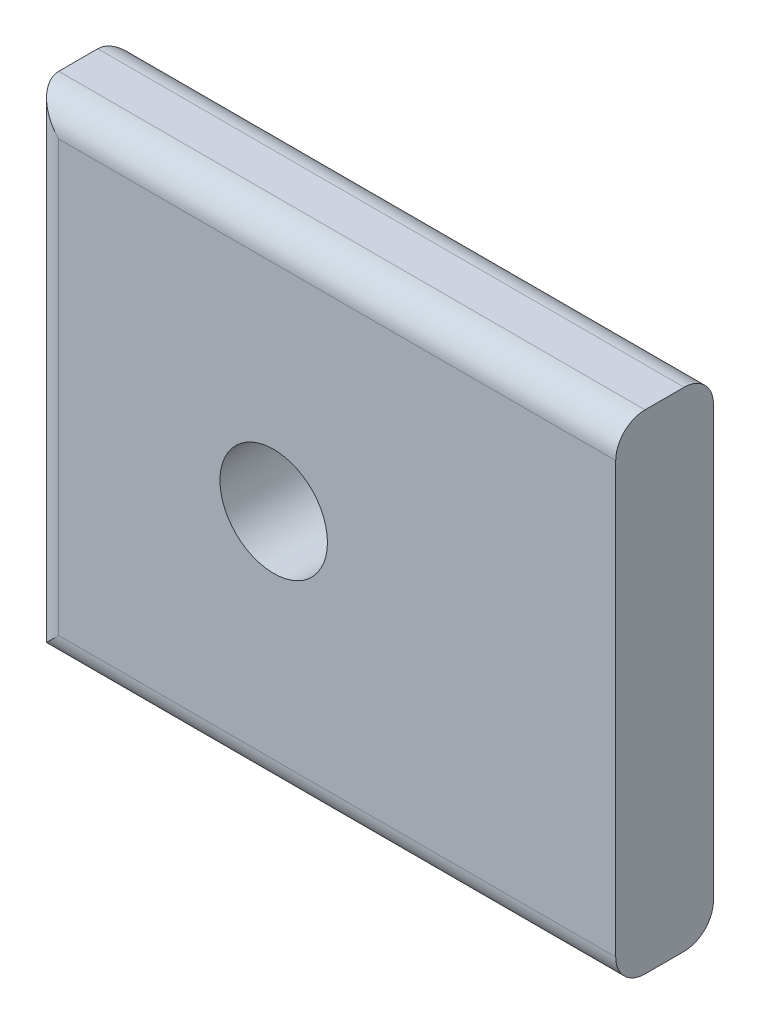
ISO-10303-21;
HEADER;
FILE_DESCRIPTION(('STEP AP214'),'2;1');
FILE_NAME('part.step','',(''),(''),'','','');
FILE_SCHEMA(('AUTOMOTIVE_DESIGN { 1 0 10303 214 1 1 1 1 }'));
ENDSEC;
DATA;
#1=APPLICATION_CONTEXT('core data for automotive mechanical design processes');
#2=APPLICATION_PROTOCOL_DEFINITION('international standard','automotive_design',2000,#1);
#3=PRODUCT_CONTEXT('',#1,'mechanical');
#4=PRODUCT('Part','Part','',(#3));
#5=PRODUCT_RELATED_PRODUCT_CATEGORY('part','',(#4));
#6=PRODUCT_DEFINITION_FORMATION('','',#4);
#7=PRODUCT_DEFINITION_CONTEXT('part definition',#1,'design');
#8=PRODUCT_DEFINITION('design','',#6,#7);
#9=PRODUCT_DEFINITION_SHAPE('','',#8);
#10=(LENGTH_UNIT() NAMED_UNIT(*) SI_UNIT(.MILLI.,.METRE.));
#11=(NAMED_UNIT(*) PLANE_ANGLE_UNIT() SI_UNIT($,.RADIAN.));
#12=(NAMED_UNIT(*) SI_UNIT($,.STERADIAN.) SOLID_ANGLE_UNIT());
#13=UNCERTAINTY_MEASURE_WITH_UNIT(LENGTH_MEASURE(1.E-05),#10,'distance_accuracy_value','');
#14=(GEOMETRIC_REPRESENTATION_CONTEXT(3) GLOBAL_UNCERTAINTY_ASSIGNED_CONTEXT((#13)) GLOBAL_UNIT_ASSIGNED_CONTEXT((#10,
#11,#12)) REPRESENTATION_CONTEXT('',''));
#15=CARTESIAN_POINT('',(0.,0.,0.));
#16=DIRECTION('',(0.,0.,1.));
#17=DIRECTION('',(1.,0.,0.));
#18=AXIS2_PLACEMENT_3D('',#15,#16,#17);
#19=CARTESIAN_POINT('',(30.,25.,10.));
#20=DIRECTION('',(-1.,0.,0.));
#21=DIRECTION('',(0.,-1.,0.));
#22=AXIS2_PLACEMENT_3D('',#19,#20,#21);
#23=PLANE('',#22);
#24=DIRECTION('',(0.,0.,-1.));
#25=VECTOR('',#24,1.);
#26=CARTESIAN_POINT('',(30.,25.,10.));
#27=LINE('',#26,#25);
#28=CARTESIAN_POINT('',(30.,25.,7.));
#29=VERTEX_POINT('',#28);
#30=CARTESIAN_POINT('',(30.,25.,3.));
#31=VERTEX_POINT('',#30);
#32=EDGE_CURVE('E179',#29,#31,#27,.T.);
#33=ORIENTED_EDGE('',*,*,#32,.F.);
#34=CARTESIAN_POINT('',(30.,22.,7.));
#35=DIRECTION('',(-1.,0.,0.));
#36=DIRECTION('',(0.,-1.,0.));
#37=AXIS2_PLACEMENT_3D('',#34,#35,#36);
#38=CIRCLE('',#37,3.);
#39=CARTESIAN_POINT('',(30.,22.,10.));
#40=VERTEX_POINT('',#39);
#41=EDGE_CURVE('E120',#29,#40,#38,.F.);
#42=ORIENTED_EDGE('',*,*,#41,.T.);
#43=DIRECTION('',(0.,1.,0.));
#44=VECTOR('',#43,1.);
#45=CARTESIAN_POINT('',(30.,25.,10.));
#46=LINE('',#45,#44);
#47=CARTESIAN_POINT('',(30.,-22.,10.));
#48=VERTEX_POINT('',#47);
#49=EDGE_CURVE('E104',#48,#40,#46,.T.);
#50=ORIENTED_EDGE('',*,*,#49,.F.);
#51=CARTESIAN_POINT('',(30.,-22.,7.));
#52=DIRECTION('',(-1.,0.,0.));
#53=DIRECTION('',(0.,-1.,0.));
#54=AXIS2_PLACEMENT_3D('',#51,#52,#53);
#55=CIRCLE('',#54,3.);
#56=CARTESIAN_POINT('',(30.,-25.,7.));
#57=VERTEX_POINT('',#56);
#58=EDGE_CURVE('E117',#48,#57,#55,.F.);
#59=ORIENTED_EDGE('',*,*,#58,.T.);
#60=DIRECTION('',(0.,0.,-1.));
#61=VECTOR('',#60,1.);
#62=CARTESIAN_POINT('',(30.,-25.,10.));
#63=LINE('',#62,#61);
#64=CARTESIAN_POINT('',(30.,-25.,3.));
#65=VERTEX_POINT('',#64);
#66=EDGE_CURVE('E121',#57,#65,#63,.T.);
#67=ORIENTED_EDGE('',*,*,#66,.T.);
#68=CARTESIAN_POINT('',(30.,-22.,3.));
#69=DIRECTION('',(-1.,0.,0.));
#70=DIRECTION('',(0.,-1.,0.));
#71=AXIS2_PLACEMENT_3D('',#68,#69,#70);
#72=CIRCLE('',#71,3.);
#73=CARTESIAN_POINT('',(30.,-22.,0.));
#74=VERTEX_POINT('',#73);
#75=EDGE_CURVE('E127',#65,#74,#72,.F.);
#76=ORIENTED_EDGE('',*,*,#75,.T.);
#77=DIRECTION('',(0.,1.,0.));
#78=VECTOR('',#77,1.);
#79=CARTESIAN_POINT('',(30.,25.,0.));
#80=LINE('',#79,#78);
#81=CARTESIAN_POINT('',(30.,22.,0.));
#82=VERTEX_POINT('',#81);
#83=EDGE_CURVE('E122',#74,#82,#80,.T.);
#84=ORIENTED_EDGE('',*,*,#83,.T.);
#85=CARTESIAN_POINT('',(30.,22.,3.));
#86=DIRECTION('',(-1.,0.,0.));
#87=DIRECTION('',(0.,-1.,0.));
#88=AXIS2_PLACEMENT_3D('',#85,#86,#87);
#89=CIRCLE('',#88,3.);
#90=EDGE_CURVE('E128',#82,#31,#89,.F.);
#91=ORIENTED_EDGE('',*,*,#90,.T.);
#92=EDGE_LOOP('',(#33,#42,#50,#59,#67,#76,#84,#91));
#93=FACE_BOUND('',#92,.T.);
#94=ADVANCED_FACE('F34',(#93),#23,.F.);
#95=CARTESIAN_POINT('',(-30.,25.,10.));
#96=DIRECTION('',(0.,-1.,0.));
#97=DIRECTION('',(0.,0.,-1.));
#98=AXIS2_PLACEMENT_3D('',#95,#96,#97);
#99=PLANE('',#98);
#100=DIRECTION('',(0.,0.,-1.));
#101=VECTOR('',#100,1.);
#102=CARTESIAN_POINT('',(-30.,25.,10.));
#103=LINE('',#102,#101);
#104=CARTESIAN_POINT('',(-30.,25.,7.));
#105=VERTEX_POINT('',#104);
#106=CARTESIAN_POINT('',(-30.,25.,3.));
#107=VERTEX_POINT('',#106);
#108=EDGE_CURVE('E176',#105,#107,#103,.T.);
#109=ORIENTED_EDGE('',*,*,#108,.F.);
#110=DIRECTION('',(-1.,0.,0.));
#111=VECTOR('',#110,1.);
#112=CARTESIAN_POINT('',(30.,25.,7.));
#113=LINE('',#112,#111);
#114=EDGE_CURVE('E131',#105,#29,#113,.F.);
#115=ORIENTED_EDGE('',*,*,#114,.T.);
#116=ORIENTED_EDGE('',*,*,#32,.T.);
#117=DIRECTION('',(-1.,0.,0.));
#118=VECTOR('',#117,1.);
#119=CARTESIAN_POINT('',(-30.,25.,3.));
#120=LINE('',#119,#118);
#121=EDGE_CURVE('E162',#31,#107,#120,.T.);
#122=ORIENTED_EDGE('',*,*,#121,.T.);
#123=EDGE_LOOP('',(#109,#115,#116,#122));
#124=FACE_BOUND('',#123,.T.);
#125=ADVANCED_FACE('F186',(#124),#99,.F.);
#126=CARTESIAN_POINT('',(-30.,25.,10.));
#127=DIRECTION('',(1.,0.,0.));
#128=DIRECTION('',(0.,1.,0.));
#129=AXIS2_PLACEMENT_3D('',#126,#127,#128);
#130=PLANE('',#129);
#131=DIRECTION('',(0.,0.,-1.));
#132=VECTOR('',#131,1.);
#133=CARTESIAN_POINT('',(-30.,-25.,10.));
#134=LINE('',#133,#132);
#135=CARTESIAN_POINT('',(-30.,-25.,7.));
#136=VERTEX_POINT('',#135);
#137=CARTESIAN_POINT('',(-30.,-25.,3.));
#138=VERTEX_POINT('',#137);
#139=EDGE_CURVE('E173',#136,#138,#134,.T.);
#140=ORIENTED_EDGE('',*,*,#139,.F.);
#141=DIRECTION('',(0.,-1.,0.));
#142=VECTOR('',#141,1.);
#143=CARTESIAN_POINT('',(-30.,25.,7.));
#144=LINE('',#143,#142);
#145=EDGE_CURVE('E11',#136,#105,#144,.F.);
#146=ORIENTED_EDGE('',*,*,#145,.T.);
#147=ORIENTED_EDGE('',*,*,#108,.T.);
#148=DIRECTION('',(0.,-1.,0.));
#149=VECTOR('',#148,1.);
#150=CARTESIAN_POINT('',(-30.,25.,3.));
#151=LINE('',#150,#149);
#152=EDGE_CURVE('E43',#107,#138,#151,.T.);
#153=ORIENTED_EDGE('',*,*,#152,.T.);
#154=EDGE_LOOP('',(#140,#146,#147,#153));
#155=FACE_BOUND('',#154,.T.);
#156=ADVANCED_FACE('F195',(#155),#130,.F.);
#157=CARTESIAN_POINT('',(-30.,-25.,10.));
#158=DIRECTION('',(0.,1.,0.));
#159=DIRECTION('',(0.,0.,1.));
#160=AXIS2_PLACEMENT_3D('',#157,#158,#159);
#161=PLANE('',#160);
#162=ORIENTED_EDGE('',*,*,#139,.T.);
#163=DIRECTION('',(1.,0.,0.));
#164=VECTOR('',#163,1.);
#165=CARTESIAN_POINT('',(-30.,-25.,3.));
#166=LINE('',#165,#164);
#167=EDGE_CURVE('E137',#138,#65,#166,.T.);
#168=ORIENTED_EDGE('',*,*,#167,.T.);
#169=ORIENTED_EDGE('',*,*,#66,.F.);
#170=DIRECTION('',(1.,0.,0.));
#171=VECTOR('',#170,1.);
#172=CARTESIAN_POINT('',(-30.,-25.,7.));
#173=LINE('',#172,#171);
#174=EDGE_CURVE('E126',#57,#136,#173,.F.);
#175=ORIENTED_EDGE('',*,*,#174,.T.);
#176=EDGE_LOOP('',(#162,#168,#169,#175));
#177=FACE_BOUND('',#176,.T.);
#178=ADVANCED_FACE('F197',(#177),#161,.F.);
#179=CARTESIAN_POINT('',(0.,0.,10.));
#180=DIRECTION('',(0.,0.,1.));
#181=DIRECTION('',(1.,0.,0.));
#182=AXIS2_PLACEMENT_3D('',#179,#180,#181);
#183=PLANE('',#182);
#184=ORIENTED_EDGE('',*,*,#49,.T.);
#185=DIRECTION('',(-1.,0.,0.));
#186=VECTOR('',#185,1.);
#187=CARTESIAN_POINT('',(-30.,22.,10.));
#188=LINE('',#187,#186);
#189=CARTESIAN_POINT('',(-27.,22.,10.));
#190=VERTEX_POINT('',#189);
#191=EDGE_CURVE('E112',#40,#190,#188,.T.);
#192=ORIENTED_EDGE('',*,*,#191,.T.);
#193=DIRECTION('',(0.,-1.,0.));
#194=VECTOR('',#193,1.);
#195=CARTESIAN_POINT('',(-27.,-25.,10.));
#196=LINE('',#195,#194);
#197=CARTESIAN_POINT('',(-27.,-22.,10.));
#198=VERTEX_POINT('',#197);
#199=EDGE_CURVE('E107',#190,#198,#196,.T.);
#200=ORIENTED_EDGE('',*,*,#199,.T.);
#201=DIRECTION('',(1.,0.,0.));
#202=VECTOR('',#201,1.);
#203=CARTESIAN_POINT('',(30.,-22.,10.));
#204=LINE('',#203,#202);
#205=EDGE_CURVE('E99',#198,#48,#204,.T.);
#206=ORIENTED_EDGE('',*,*,#205,.T.);
#207=EDGE_LOOP('',(#184,#192,#200,#206));
#208=FACE_BOUND('',#207,.T.);
#209=CARTESIAN_POINT('',(-5.,0.,10.));
#210=DIRECTION('',(0.,0.,1.));
#211=DIRECTION('',(1.,0.,0.));
#212=AXIS2_PLACEMENT_3D('',#209,#210,#211);
#213=CIRCLE('',#212,5.5);
#214=CARTESIAN_POINT('',(0.500000000000002,0.,10.));
#215=VERTEX_POINT('',#214);
#216=EDGE_CURVE('E148',#215,#215,#213,.T.);
#217=ORIENTED_EDGE('',*,*,#216,.F.);
#218=EDGE_LOOP('',(#217));
#219=FACE_BOUND('',#218,.T.);
#220=ADVANCED_FACE('F101',(#208,#219),#183,.T.);
#221=CARTESIAN_POINT('',(0.,0.,0.));
#222=DIRECTION('',(0.,0.,1.));
#223=DIRECTION('',(1.,0.,0.));
#224=AXIS2_PLACEMENT_3D('',#221,#222,#223);
#225=PLANE('',#224);
#226=CARTESIAN_POINT('',(-5.,0.,0.));
#227=DIRECTION('',(0.,0.,1.));
#228=DIRECTION('',(1.,0.,0.));
#229=AXIS2_PLACEMENT_3D('',#226,#227,#228);
#230=CIRCLE('',#229,5.5);
#231=CARTESIAN_POINT('',(0.500000000000002,0.,0.));
#232=VERTEX_POINT('',#231);
#233=EDGE_CURVE('E166',#232,#232,#230,.T.);
#234=ORIENTED_EDGE('',*,*,#233,.T.);
#235=EDGE_LOOP('',(#234));
#236=FACE_BOUND('',#235,.T.);
#237=ORIENTED_EDGE('',*,*,#83,.F.);
#238=DIRECTION('',(1.,0.,0.));
#239=VECTOR('',#238,1.);
#240=CARTESIAN_POINT('',(0.,-22.,0.));
#241=LINE('',#240,#239);
#242=CARTESIAN_POINT('',(-27.,-22.,0.));
#243=VERTEX_POINT('',#242);
#244=EDGE_CURVE('E51',#74,#243,#241,.F.);
#245=ORIENTED_EDGE('',*,*,#244,.T.);
#246=DIRECTION('',(0.,-1.,0.));
#247=VECTOR('',#246,1.);
#248=CARTESIAN_POINT('',(-27.,0.,0.));
#249=LINE('',#248,#247);
#250=CARTESIAN_POINT('',(-27.,22.,0.));
#251=VERTEX_POINT('',#250);
#252=EDGE_CURVE('E55',#243,#251,#249,.F.);
#253=ORIENTED_EDGE('',*,*,#252,.T.);
#254=DIRECTION('',(-1.,0.,0.));
#255=VECTOR('',#254,1.);
#256=CARTESIAN_POINT('',(0.,22.,0.));
#257=LINE('',#256,#255);
#258=EDGE_CURVE('E140',#251,#82,#257,.F.);
#259=ORIENTED_EDGE('',*,*,#258,.T.);
#260=EDGE_LOOP('',(#237,#245,#253,#259));
#261=FACE_BOUND('',#260,.T.);
#262=ADVANCED_FACE('F164',(#236,#261),#225,.F.);
#263=CARTESIAN_POINT('',(-5.,0.,0.));
#264=DIRECTION('',(0.,0.,1.));
#265=DIRECTION('',(1.,0.,0.));
#266=AXIS2_PLACEMENT_3D('',#263,#264,#265);
#267=CYLINDRICAL_SURFACE('',#266,5.5);
#268=ORIENTED_EDGE('',*,*,#233,.F.);
#269=EDGE_LOOP('',(#268));
#270=FACE_BOUND('',#269,.T.);
#271=ORIENTED_EDGE('',*,*,#216,.T.);
#272=EDGE_LOOP('',(#271));
#273=FACE_BOUND('',#272,.T.);
#274=ADVANCED_FACE('F217',(#270,#273),#267,.F.);
#275=CARTESIAN_POINT('',(0.,-22.,7.));
#276=DIRECTION('',(-1.,0.,0.));
#277=DIRECTION('',(0.,0.,1.));
#278=AXIS2_PLACEMENT_3D('',#275,#276,#277);
#279=CYLINDRICAL_SURFACE('',#278,3.);
#280=ORIENTED_EDGE('',*,*,#58,.F.);
#281=ORIENTED_EDGE('',*,*,#205,.F.);
#282=CARTESIAN_POINT('',(-27.,-22.,7.));
#283=DIRECTION('',(-0.707106781186548,0.707106781186547,0.));
#284=DIRECTION('',(0.707106781186547,0.707106781186548,0.));
#285=AXIS2_PLACEMENT_3D('',#282,#283,#284);
#286=ELLIPSE('',#285,4.24264068711928,3.);
#287=EDGE_CURVE('E147',#136,#198,#286,.T.);
#288=ORIENTED_EDGE('',*,*,#287,.F.);
#289=ORIENTED_EDGE('',*,*,#174,.F.);
#290=EDGE_LOOP('',(#280,#281,#288,#289));
#291=FACE_BOUND('',#290,.T.);
#292=ADVANCED_FACE('F125',(#291),#279,.T.);
#293=CARTESIAN_POINT('',(-27.,0.,7.));
#294=DIRECTION('',(0.,1.,0.));
#295=DIRECTION('',(-1.,0.,0.));
#296=AXIS2_PLACEMENT_3D('',#293,#294,#295);
#297=CYLINDRICAL_SURFACE('',#296,3.);
#298=ORIENTED_EDGE('',*,*,#287,.T.);
#299=ORIENTED_EDGE('',*,*,#199,.F.);
#300=CARTESIAN_POINT('',(-27.,22.,7.));
#301=DIRECTION('',(0.707106781186547,0.707106781186548,0.));
#302=DIRECTION('',(-0.707106781186548,0.707106781186547,0.));
#303=AXIS2_PLACEMENT_3D('',#300,#301,#302);
#304=ELLIPSE('',#303,4.24264068711929,3.);
#305=EDGE_CURVE('E145',#105,#190,#304,.T.);
#306=ORIENTED_EDGE('',*,*,#305,.F.);
#307=ORIENTED_EDGE('',*,*,#145,.F.);
#308=EDGE_LOOP('',(#298,#299,#306,#307));
#309=FACE_BOUND('',#308,.T.);
#310=ADVANCED_FACE('F192',(#309),#297,.T.);
#311=CARTESIAN_POINT('',(0.,22.,7.));
#312=DIRECTION('',(1.,0.,0.));
#313=DIRECTION('',(0.,0.,-1.));
#314=AXIS2_PLACEMENT_3D('',#311,#312,#313);
#315=CYLINDRICAL_SURFACE('',#314,3.);
#316=ORIENTED_EDGE('',*,*,#41,.F.);
#317=ORIENTED_EDGE('',*,*,#114,.F.);
#318=ORIENTED_EDGE('',*,*,#305,.T.);
#319=ORIENTED_EDGE('',*,*,#191,.F.);
#320=EDGE_LOOP('',(#316,#317,#318,#319));
#321=FACE_BOUND('',#320,.T.);
#322=ADVANCED_FACE('F189',(#321),#315,.T.);
#323=CARTESIAN_POINT('',(-30.,22.,3.));
#324=DIRECTION('',(-1.,0.,0.));
#325=DIRECTION('',(0.,0.,1.));
#326=AXIS2_PLACEMENT_3D('',#323,#324,#325);
#327=CYLINDRICAL_SURFACE('',#326,3.);
#328=ORIENTED_EDGE('',*,*,#90,.F.);
#329=ORIENTED_EDGE('',*,*,#258,.F.);
#330=CARTESIAN_POINT('',(-27.,22.,3.));
#331=DIRECTION('',(-0.707106781186547,-0.707106781186548,0.));
#332=DIRECTION('',(-0.707106781186548,0.707106781186547,0.));
#333=AXIS2_PLACEMENT_3D('',#330,#331,#332);
#334=ELLIPSE('',#333,4.24264068711929,3.);
#335=EDGE_CURVE('E38',#107,#251,#334,.T.);
#336=ORIENTED_EDGE('',*,*,#335,.F.);
#337=ORIENTED_EDGE('',*,*,#121,.F.);
#338=EDGE_LOOP('',(#328,#329,#336,#337));
#339=FACE_BOUND('',#338,.T.);
#340=ADVANCED_FACE('F36',(#339),#327,.T.);
#341=CARTESIAN_POINT('',(-27.,25.,3.));
#342=DIRECTION('',(0.,-1.,0.));
#343=DIRECTION('',(1.,0.,0.));
#344=AXIS2_PLACEMENT_3D('',#341,#342,#343);
#345=CYLINDRICAL_SURFACE('',#344,3.);
#346=ORIENTED_EDGE('',*,*,#335,.T.);
#347=ORIENTED_EDGE('',*,*,#252,.F.);
#348=CARTESIAN_POINT('',(-27.,-22.,3.));
#349=DIRECTION('',(0.707106781186548,-0.707106781186547,0.));
#350=DIRECTION('',(-0.707106781186547,-0.707106781186548,0.));
#351=AXIS2_PLACEMENT_3D('',#348,#349,#350);
#352=ELLIPSE('',#351,4.24264068711928,3.);
#353=EDGE_CURVE('E149',#138,#243,#352,.T.);
#354=ORIENTED_EDGE('',*,*,#353,.F.);
#355=ORIENTED_EDGE('',*,*,#152,.F.);
#356=EDGE_LOOP('',(#346,#347,#354,#355));
#357=FACE_BOUND('',#356,.T.);
#358=ADVANCED_FACE('F158',(#357),#345,.T.);
#359=CARTESIAN_POINT('',(-30.,-22.,3.));
#360=DIRECTION('',(1.,0.,0.));
#361=DIRECTION('',(0.,0.,-1.));
#362=AXIS2_PLACEMENT_3D('',#359,#360,#361);
#363=CYLINDRICAL_SURFACE('',#362,3.);
#364=ORIENTED_EDGE('',*,*,#353,.T.);
#365=ORIENTED_EDGE('',*,*,#244,.F.);
#366=ORIENTED_EDGE('',*,*,#75,.F.);
#367=ORIENTED_EDGE('',*,*,#167,.F.);
#368=EDGE_LOOP('',(#364,#365,#366,#367));
#369=FACE_BOUND('',#368,.T.);
#370=ADVANCED_FACE('F198',(#369),#363,.T.);
#371=CLOSED_SHELL('',(#94,#125,#156,#178,#220,#262,#274,#292,#310,#322,#340,#358,#370));
#372=MANIFOLD_SOLID_BREP('B2',#371);
#373=ADVANCED_BREP_SHAPE_REPRESENTATION('',(#18,#372),#14);
#374=SHAPE_DEFINITION_REPRESENTATION(#9,#373);
ENDSEC;
END-ISO-10303-21;
